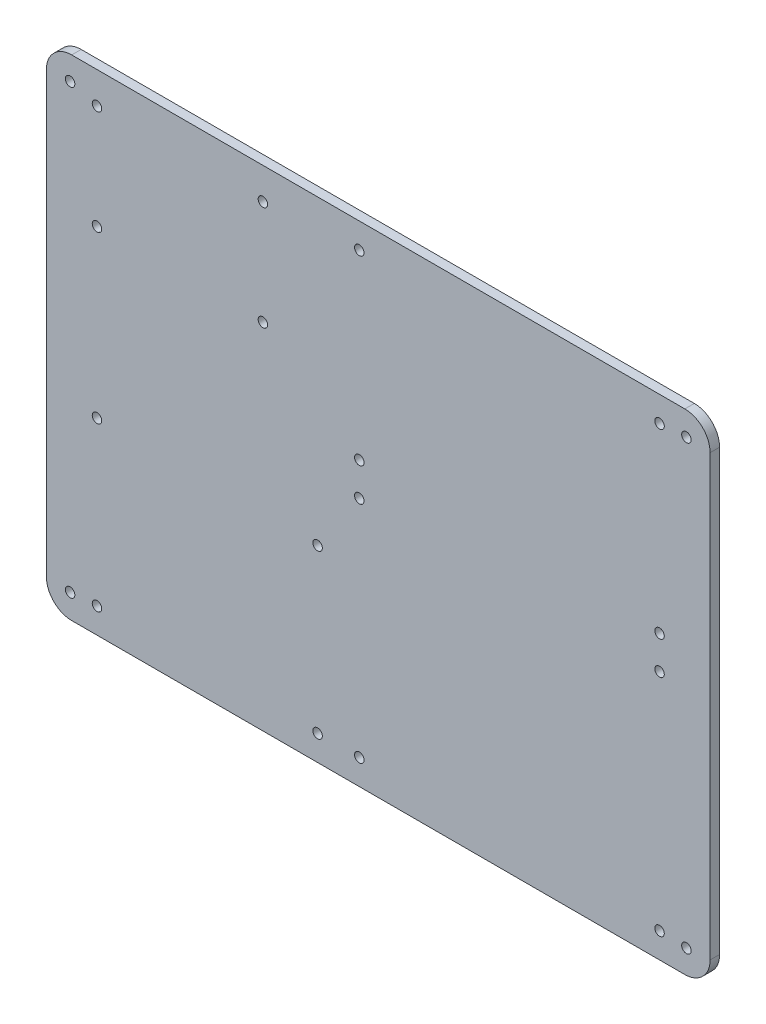
ISO-10303-21;
HEADER;
FILE_DESCRIPTION(('STEP AP214'),'2;1');
FILE_NAME('part.step','',(''),(''),'','','');
FILE_SCHEMA(('AUTOMOTIVE_DESIGN { 1 0 10303 214 1 1 1 1 }'));
ENDSEC;
DATA;
#1=APPLICATION_CONTEXT('core data for automotive mechanical design processes');
#2=APPLICATION_PROTOCOL_DEFINITION('international standard','automotive_design',2000,#1);
#3=PRODUCT_CONTEXT('',#1,'mechanical');
#4=PRODUCT('Part','Part','',(#3));
#5=PRODUCT_RELATED_PRODUCT_CATEGORY('part','',(#4));
#6=PRODUCT_DEFINITION_FORMATION('','',#4);
#7=PRODUCT_DEFINITION_CONTEXT('part definition',#1,'design');
#8=PRODUCT_DEFINITION('design','',#6,#7);
#9=PRODUCT_DEFINITION_SHAPE('','',#8);
#10=(LENGTH_UNIT() NAMED_UNIT(*) SI_UNIT(.MILLI.,.METRE.));
#11=(NAMED_UNIT(*) PLANE_ANGLE_UNIT() SI_UNIT($,.RADIAN.));
#12=(NAMED_UNIT(*) SI_UNIT($,.STERADIAN.) SOLID_ANGLE_UNIT());
#13=UNCERTAINTY_MEASURE_WITH_UNIT(LENGTH_MEASURE(1.E-05),#10,'distance_accuracy_value','');
#14=(GEOMETRIC_REPRESENTATION_CONTEXT(3) GLOBAL_UNCERTAINTY_ASSIGNED_CONTEXT((#13)) GLOBAL_UNIT_ASSIGNED_CONTEXT((#10,
#11,#12)) REPRESENTATION_CONTEXT('',''));
#15=CARTESIAN_POINT('',(0.,0.,0.));
#16=DIRECTION('',(0.,0.,1.));
#17=DIRECTION('',(1.,0.,0.));
#18=AXIS2_PLACEMENT_3D('',#15,#16,#17);
#19=CARTESIAN_POINT('',(0.,77.5,3.));
#20=DIRECTION('',(0.,1.,0.));
#21=DIRECTION('',(0.,0.,1.));
#22=AXIS2_PLACEMENT_3D('',#19,#20,#21);
#23=PLANE('',#22);
#24=DIRECTION('',(1.,0.,0.));
#25=VECTOR('',#24,1.);
#26=CARTESIAN_POINT('',(0.,77.5,0.));
#27=LINE('',#26,#25);
#28=CARTESIAN_POINT('',(-97.,77.5,0.));
#29=VERTEX_POINT('',#28);
#30=CARTESIAN_POINT('',(97.,77.5,0.));
#31=VERTEX_POINT('',#30);
#32=EDGE_CURVE('E154',#29,#31,#27,.T.);
#33=ORIENTED_EDGE('',*,*,#32,.F.);
#34=DIRECTION('',(0.,0.,-1.));
#35=VECTOR('',#34,1.);
#36=CARTESIAN_POINT('',(-97.,77.5,3.));
#37=LINE('',#36,#35);
#38=CARTESIAN_POINT('',(-97.,77.5,3.));
#39=VERTEX_POINT('',#38);
#40=EDGE_CURVE('E12',#39,#29,#37,.T.);
#41=ORIENTED_EDGE('',*,*,#40,.F.);
#42=DIRECTION('',(1.,0.,0.));
#43=VECTOR('',#42,1.);
#44=CARTESIAN_POINT('',(0.,77.5,3.));
#45=LINE('',#44,#43);
#46=CARTESIAN_POINT('',(97.,77.5,3.));
#47=VERTEX_POINT('',#46);
#48=EDGE_CURVE('E350',#39,#47,#45,.T.);
#49=ORIENTED_EDGE('',*,*,#48,.T.);
#50=DIRECTION('',(0.,0.,-1.));
#51=VECTOR('',#50,1.);
#52=CARTESIAN_POINT('',(97.,77.5,3.));
#53=LINE('',#52,#51);
#54=EDGE_CURVE('E60',#47,#31,#53,.T.);
#55=ORIENTED_EDGE('',*,*,#54,.T.);
#56=EDGE_LOOP('',(#33,#41,#49,#55));
#57=FACE_BOUND('',#56,.T.);
#58=ADVANCED_FACE('F41',(#57),#23,.T.);
#59=CARTESIAN_POINT('',(-97.,69.5,3.));
#60=DIRECTION('',(0.,0.,-1.));
#61=DIRECTION('',(-1.,0.,0.));
#62=AXIS2_PLACEMENT_3D('',#59,#60,#61);
#63=CYLINDRICAL_SURFACE('',#62,8.);
#64=CARTESIAN_POINT('',(-97.,69.5,0.));
#65=DIRECTION('',(0.,0.,1.));
#66=DIRECTION('',(1.,0.,0.));
#67=AXIS2_PLACEMENT_3D('',#64,#65,#66);
#68=CIRCLE('',#67,8.);
#69=CARTESIAN_POINT('',(-105.,69.5,0.));
#70=VERTEX_POINT('',#69);
#71=EDGE_CURVE('E156',#29,#70,#68,.T.);
#72=ORIENTED_EDGE('',*,*,#71,.T.);
#73=DIRECTION('',(0.,0.,-1.));
#74=VECTOR('',#73,1.);
#75=CARTESIAN_POINT('',(-105.,69.5,3.));
#76=LINE('',#75,#74);
#77=CARTESIAN_POINT('',(-105.,69.5,3.));
#78=VERTEX_POINT('',#77);
#79=EDGE_CURVE('E51',#78,#70,#76,.T.);
#80=ORIENTED_EDGE('',*,*,#79,.F.);
#81=CARTESIAN_POINT('',(-97.,69.5,3.));
#82=DIRECTION('',(0.,0.,1.));
#83=DIRECTION('',(1.,0.,0.));
#84=AXIS2_PLACEMENT_3D('',#81,#82,#83);
#85=CIRCLE('',#84,8.);
#86=EDGE_CURVE('E354',#39,#78,#85,.T.);
#87=ORIENTED_EDGE('',*,*,#86,.F.);
#88=ORIENTED_EDGE('',*,*,#40,.T.);
#89=EDGE_LOOP('',(#72,#80,#87,#88));
#90=FACE_BOUND('',#89,.T.);
#91=ADVANCED_FACE('F402',(#90),#63,.T.);
#92=CARTESIAN_POINT('',(-105.,0.,3.));
#93=DIRECTION('',(1.,0.,0.));
#94=DIRECTION('',(0.,1.,0.));
#95=AXIS2_PLACEMENT_3D('',#92,#93,#94);
#96=PLANE('',#95);
#97=DIRECTION('',(0.,-1.,0.));
#98=VECTOR('',#97,1.);
#99=CARTESIAN_POINT('',(-105.,0.,0.));
#100=LINE('',#99,#98);
#101=CARTESIAN_POINT('',(-105.,-69.5,0.));
#102=VERTEX_POINT('',#101);
#103=EDGE_CURVE('E159',#70,#102,#100,.T.);
#104=ORIENTED_EDGE('',*,*,#103,.T.);
#105=DIRECTION('',(0.,0.,-1.));
#106=VECTOR('',#105,1.);
#107=CARTESIAN_POINT('',(-105.,-69.5,3.));
#108=LINE('',#107,#106);
#109=CARTESIAN_POINT('',(-105.,-69.5,3.));
#110=VERTEX_POINT('',#109);
#111=EDGE_CURVE('E181',#110,#102,#108,.T.);
#112=ORIENTED_EDGE('',*,*,#111,.F.);
#113=DIRECTION('',(0.,-1.,0.));
#114=VECTOR('',#113,1.);
#115=CARTESIAN_POINT('',(-105.,0.,3.));
#116=LINE('',#115,#114);
#117=EDGE_CURVE('E373',#78,#110,#116,.T.);
#118=ORIENTED_EDGE('',*,*,#117,.F.);
#119=ORIENTED_EDGE('',*,*,#79,.T.);
#120=EDGE_LOOP('',(#104,#112,#118,#119));
#121=FACE_BOUND('',#120,.T.);
#122=ADVANCED_FACE('F407',(#121),#96,.F.);
#123=CARTESIAN_POINT('',(-97.,-69.5,3.));
#124=DIRECTION('',(0.,0.,-1.));
#125=DIRECTION('',(-1.,0.,0.));
#126=AXIS2_PLACEMENT_3D('',#123,#124,#125);
#127=CYLINDRICAL_SURFACE('',#126,7.99999999999999);
#128=CARTESIAN_POINT('',(-97.,-69.5,0.));
#129=DIRECTION('',(0.,0.,1.));
#130=DIRECTION('',(1.,0.,0.));
#131=AXIS2_PLACEMENT_3D('',#128,#129,#130);
#132=CIRCLE('',#131,7.99999999999999);
#133=CARTESIAN_POINT('',(-97.,-77.5,0.));
#134=VERTEX_POINT('',#133);
#135=EDGE_CURVE('E162',#102,#134,#132,.T.);
#136=ORIENTED_EDGE('',*,*,#135,.T.);
#137=DIRECTION('',(0.,0.,-1.));
#138=VECTOR('',#137,1.);
#139=CARTESIAN_POINT('',(-97.,-77.5,3.));
#140=LINE('',#139,#138);
#141=CARTESIAN_POINT('',(-97.,-77.5,3.));
#142=VERTEX_POINT('',#141);
#143=EDGE_CURVE('E178',#142,#134,#140,.T.);
#144=ORIENTED_EDGE('',*,*,#143,.F.);
#145=CARTESIAN_POINT('',(-97.,-69.5,3.));
#146=DIRECTION('',(0.,0.,1.));
#147=DIRECTION('',(1.,0.,0.));
#148=AXIS2_PLACEMENT_3D('',#145,#146,#147);
#149=CIRCLE('',#148,7.99999999999999);
#150=EDGE_CURVE('E378',#110,#142,#149,.T.);
#151=ORIENTED_EDGE('',*,*,#150,.F.);
#152=ORIENTED_EDGE('',*,*,#111,.T.);
#153=EDGE_LOOP('',(#136,#144,#151,#152));
#154=FACE_BOUND('',#153,.T.);
#155=ADVANCED_FACE('F387',(#154),#127,.T.);
#156=CARTESIAN_POINT('',(0.,-77.5,3.));
#157=DIRECTION('',(0.,1.,0.));
#158=DIRECTION('',(0.,0.,1.));
#159=AXIS2_PLACEMENT_3D('',#156,#157,#158);
#160=PLANE('',#159);
#161=DIRECTION('',(1.,0.,0.));
#162=VECTOR('',#161,1.);
#163=CARTESIAN_POINT('',(0.,-77.5,0.));
#164=LINE('',#163,#162);
#165=CARTESIAN_POINT('',(97.,-77.5,0.));
#166=VERTEX_POINT('',#165);
#167=EDGE_CURVE('E165',#134,#166,#164,.T.);
#168=ORIENTED_EDGE('',*,*,#167,.T.);
#169=DIRECTION('',(0.,0.,-1.));
#170=VECTOR('',#169,1.);
#171=CARTESIAN_POINT('',(97.,-77.5,3.));
#172=LINE('',#171,#170);
#173=CARTESIAN_POINT('',(97.,-77.5,3.));
#174=VERTEX_POINT('',#173);
#175=EDGE_CURVE('E130',#174,#166,#172,.T.);
#176=ORIENTED_EDGE('',*,*,#175,.F.);
#177=DIRECTION('',(1.,0.,0.));
#178=VECTOR('',#177,1.);
#179=CARTESIAN_POINT('',(0.,-77.5,3.));
#180=LINE('',#179,#178);
#181=EDGE_CURVE('E118',#142,#174,#180,.T.);
#182=ORIENTED_EDGE('',*,*,#181,.F.);
#183=ORIENTED_EDGE('',*,*,#143,.T.);
#184=EDGE_LOOP('',(#168,#176,#182,#183));
#185=FACE_BOUND('',#184,.T.);
#186=ADVANCED_FACE('F389',(#185),#160,.F.);
#187=CARTESIAN_POINT('',(97.,-69.5,3.));
#188=DIRECTION('',(0.,0.,-1.));
#189=DIRECTION('',(-1.,0.,0.));
#190=AXIS2_PLACEMENT_3D('',#187,#188,#189);
#191=CYLINDRICAL_SURFACE('',#190,7.99999999999998);
#192=CARTESIAN_POINT('',(97.,-69.5,0.));
#193=DIRECTION('',(0.,0.,1.));
#194=DIRECTION('',(1.,0.,0.));
#195=AXIS2_PLACEMENT_3D('',#192,#193,#194);
#196=CIRCLE('',#195,7.99999999999998);
#197=CARTESIAN_POINT('',(105.,-69.5,0.));
#198=VERTEX_POINT('',#197);
#199=EDGE_CURVE('E127',#166,#198,#196,.T.);
#200=ORIENTED_EDGE('',*,*,#199,.T.);
#201=DIRECTION('',(0.,0.,-1.));
#202=VECTOR('',#201,1.);
#203=CARTESIAN_POINT('',(105.,-69.5,3.));
#204=LINE('',#203,#202);
#205=CARTESIAN_POINT('',(105.,-69.5,3.));
#206=VERTEX_POINT('',#205);
#207=EDGE_CURVE('E125',#206,#198,#204,.T.);
#208=ORIENTED_EDGE('',*,*,#207,.F.);
#209=CARTESIAN_POINT('',(97.,-69.5,3.));
#210=DIRECTION('',(0.,0.,1.));
#211=DIRECTION('',(1.,0.,0.));
#212=AXIS2_PLACEMENT_3D('',#209,#210,#211);
#213=CIRCLE('',#212,7.99999999999998);
#214=EDGE_CURVE('E110',#174,#206,#213,.T.);
#215=ORIENTED_EDGE('',*,*,#214,.F.);
#216=ORIENTED_EDGE('',*,*,#175,.T.);
#217=EDGE_LOOP('',(#200,#208,#215,#216));
#218=FACE_BOUND('',#217,.T.);
#219=ADVANCED_FACE('F126',(#218),#191,.T.);
#220=CARTESIAN_POINT('',(105.,0.,3.));
#221=DIRECTION('',(1.,0.,0.));
#222=DIRECTION('',(0.,1.,0.));
#223=AXIS2_PLACEMENT_3D('',#220,#221,#222);
#224=PLANE('',#223);
#225=DIRECTION('',(0.,-1.,0.));
#226=VECTOR('',#225,1.);
#227=CARTESIAN_POINT('',(105.,0.,0.));
#228=LINE('',#227,#226);
#229=CARTESIAN_POINT('',(105.,69.5,0.));
#230=VERTEX_POINT('',#229);
#231=EDGE_CURVE('E169',#230,#198,#228,.T.);
#232=ORIENTED_EDGE('',*,*,#231,.F.);
#233=DIRECTION('',(0.,0.,-1.));
#234=VECTOR('',#233,1.);
#235=CARTESIAN_POINT('',(105.,69.5,3.));
#236=LINE('',#235,#234);
#237=CARTESIAN_POINT('',(105.,69.5,3.));
#238=VERTEX_POINT('',#237);
#239=EDGE_CURVE('E85',#238,#230,#236,.T.);
#240=ORIENTED_EDGE('',*,*,#239,.F.);
#241=DIRECTION('',(0.,-1.,0.));
#242=VECTOR('',#241,1.);
#243=CARTESIAN_POINT('',(105.,0.,3.));
#244=LINE('',#243,#242);
#245=EDGE_CURVE('E116',#238,#206,#244,.T.);
#246=ORIENTED_EDGE('',*,*,#245,.T.);
#247=ORIENTED_EDGE('',*,*,#207,.T.);
#248=EDGE_LOOP('',(#232,#240,#246,#247));
#249=FACE_BOUND('',#248,.T.);
#250=ADVANCED_FACE('F132',(#249),#224,.T.);
#251=CARTESIAN_POINT('',(97.5,-70.,3.));
#252=DIRECTION('',(0.,0.,-1.));
#253=DIRECTION('',(-1.,0.,0.));
#254=AXIS2_PLACEMENT_3D('',#251,#252,#253);
#255=CYLINDRICAL_SURFACE('',#254,1.5);
#256=CARTESIAN_POINT('',(97.5,-70.,3.));
#257=DIRECTION('',(0.,0.,1.));
#258=DIRECTION('',(1.,0.,0.));
#259=AXIS2_PLACEMENT_3D('',#256,#257,#258);
#260=CIRCLE('',#259,1.5);
#261=CARTESIAN_POINT('',(99.,-70.,3.));
#262=VERTEX_POINT('',#261);
#263=EDGE_CURVE('E347',#262,#262,#260,.T.);
#264=ORIENTED_EDGE('',*,*,#263,.T.);
#265=EDGE_LOOP('',(#264));
#266=FACE_BOUND('',#265,.T.);
#267=CARTESIAN_POINT('',(97.5,-70.,0.));
#268=DIRECTION('',(0.,0.,1.));
#269=DIRECTION('',(1.,0.,0.));
#270=AXIS2_PLACEMENT_3D('',#267,#268,#269);
#271=CIRCLE('',#270,1.5);
#272=CARTESIAN_POINT('',(99.,-70.,0.));
#273=VERTEX_POINT('',#272);
#274=EDGE_CURVE('E151',#273,#273,#271,.T.);
#275=ORIENTED_EDGE('',*,*,#274,.F.);
#276=EDGE_LOOP('',(#275));
#277=FACE_BOUND('',#276,.T.);
#278=ADVANCED_FACE('F412',(#266,#277),#255,.F.);
#279=CARTESIAN_POINT('',(-97.5,-70.,3.));
#280=DIRECTION('',(0.,0.,-1.));
#281=DIRECTION('',(-1.,0.,0.));
#282=AXIS2_PLACEMENT_3D('',#279,#280,#281);
#283=CYLINDRICAL_SURFACE('',#282,1.5);
#284=CARTESIAN_POINT('',(-97.5,-70.,3.));
#285=DIRECTION('',(0.,0.,1.));
#286=DIRECTION('',(1.,0.,0.));
#287=AXIS2_PLACEMENT_3D('',#284,#285,#286);
#288=CIRCLE('',#287,1.5);
#289=CARTESIAN_POINT('',(-96.,-70.,3.));
#290=VERTEX_POINT('',#289);
#291=EDGE_CURVE('E344',#290,#290,#288,.T.);
#292=ORIENTED_EDGE('',*,*,#291,.T.);
#293=EDGE_LOOP('',(#292));
#294=FACE_BOUND('',#293,.T.);
#295=CARTESIAN_POINT('',(-97.5,-70.,0.));
#296=DIRECTION('',(0.,0.,1.));
#297=DIRECTION('',(1.,0.,0.));
#298=AXIS2_PLACEMENT_3D('',#295,#296,#297);
#299=CIRCLE('',#298,1.5);
#300=CARTESIAN_POINT('',(-96.,-70.,0.));
#301=VERTEX_POINT('',#300);
#302=EDGE_CURVE('E148',#301,#301,#299,.T.);
#303=ORIENTED_EDGE('',*,*,#302,.F.);
#304=EDGE_LOOP('',(#303));
#305=FACE_BOUND('',#304,.T.);
#306=ADVANCED_FACE('F415',(#294,#305),#283,.F.);
#307=CARTESIAN_POINT('',(97.5,70.,3.));
#308=DIRECTION('',(0.,0.,-1.));
#309=DIRECTION('',(-1.,0.,0.));
#310=AXIS2_PLACEMENT_3D('',#307,#308,#309);
#311=CYLINDRICAL_SURFACE('',#310,1.5);
#312=CARTESIAN_POINT('',(97.5,70.,3.));
#313=DIRECTION('',(0.,0.,1.));
#314=DIRECTION('',(1.,0.,0.));
#315=AXIS2_PLACEMENT_3D('',#312,#313,#314);
#316=CIRCLE('',#315,1.5);
#317=CARTESIAN_POINT('',(99.,70.,3.));
#318=VERTEX_POINT('',#317);
#319=EDGE_CURVE('E340',#318,#318,#316,.T.);
#320=ORIENTED_EDGE('',*,*,#319,.T.);
#321=EDGE_LOOP('',(#320));
#322=FACE_BOUND('',#321,.T.);
#323=CARTESIAN_POINT('',(97.5,70.,0.));
#324=DIRECTION('',(0.,0.,1.));
#325=DIRECTION('',(1.,0.,0.));
#326=AXIS2_PLACEMENT_3D('',#323,#324,#325);
#327=CIRCLE('',#326,1.5);
#328=CARTESIAN_POINT('',(99.,70.,0.));
#329=VERTEX_POINT('',#328);
#330=EDGE_CURVE('E144',#329,#329,#327,.T.);
#331=ORIENTED_EDGE('',*,*,#330,.F.);
#332=EDGE_LOOP('',(#331));
#333=FACE_BOUND('',#332,.T.);
#334=ADVANCED_FACE('F397',(#322,#333),#311,.F.);
#335=CARTESIAN_POINT('',(-97.5,70.,3.));
#336=DIRECTION('',(0.,0.,-1.));
#337=DIRECTION('',(-1.,0.,0.));
#338=AXIS2_PLACEMENT_3D('',#335,#336,#337);
#339=CYLINDRICAL_SURFACE('',#338,1.5);
#340=CARTESIAN_POINT('',(-97.5,70.,3.));
#341=DIRECTION('',(0.,0.,1.));
#342=DIRECTION('',(1.,0.,0.));
#343=AXIS2_PLACEMENT_3D('',#340,#341,#342);
#344=CIRCLE('',#343,1.5);
#345=CARTESIAN_POINT('',(-96.,70.,3.));
#346=VERTEX_POINT('',#345);
#347=EDGE_CURVE('E174',#346,#346,#344,.T.);
#348=ORIENTED_EDGE('',*,*,#347,.T.);
#349=EDGE_LOOP('',(#348));
#350=FACE_BOUND('',#349,.T.);
#351=CARTESIAN_POINT('',(-97.5,70.,0.));
#352=DIRECTION('',(0.,0.,1.));
#353=DIRECTION('',(1.,0.,0.));
#354=AXIS2_PLACEMENT_3D('',#351,#352,#353);
#355=CIRCLE('',#354,1.5);
#356=CARTESIAN_POINT('',(-96.,70.,0.));
#357=VERTEX_POINT('',#356);
#358=EDGE_CURVE('E141',#357,#357,#355,.T.);
#359=ORIENTED_EDGE('',*,*,#358,.F.);
#360=EDGE_LOOP('',(#359));
#361=FACE_BOUND('',#360,.T.);
#362=ADVANCED_FACE('F43',(#350,#361),#339,.F.);
#363=CARTESIAN_POINT('',(97.,69.5,3.));
#364=DIRECTION('',(0.,0.,-1.));
#365=DIRECTION('',(-1.,0.,0.));
#366=AXIS2_PLACEMENT_3D('',#363,#364,#365);
#367=CYLINDRICAL_SURFACE('',#366,8.00000000000001);
#368=CARTESIAN_POINT('',(97.,69.5,0.));
#369=DIRECTION('',(0.,0.,1.));
#370=DIRECTION('',(1.,0.,0.));
#371=AXIS2_PLACEMENT_3D('',#368,#369,#370);
#372=CIRCLE('',#371,8.00000000000001);
#373=EDGE_CURVE('E171',#31,#230,#372,.F.);
#374=ORIENTED_EDGE('',*,*,#373,.F.);
#375=ORIENTED_EDGE('',*,*,#54,.F.);
#376=CARTESIAN_POINT('',(97.,69.5,3.));
#377=DIRECTION('',(0.,0.,1.));
#378=DIRECTION('',(1.,0.,0.));
#379=AXIS2_PLACEMENT_3D('',#376,#377,#378);
#380=CIRCLE('',#379,8.00000000000001);
#381=EDGE_CURVE('E134',#47,#238,#380,.F.);
#382=ORIENTED_EDGE('',*,*,#381,.T.);
#383=ORIENTED_EDGE('',*,*,#239,.T.);
#384=EDGE_LOOP('',(#374,#375,#382,#383));
#385=FACE_BOUND('',#384,.T.);
#386=ADVANCED_FACE('F293',(#385),#367,.T.);
#387=CARTESIAN_POINT('',(0.,0.,3.));
#388=DIRECTION('',(0.,0.,1.));
#389=DIRECTION('',(1.,0.,0.));
#390=AXIS2_PLACEMENT_3D('',#387,#388,#389);
#391=PLANE('',#390);
#392=CARTESIAN_POINT('',(-36.5,67.5,3.));
#393=DIRECTION('',(0.,0.,1.));
#394=DIRECTION('',(1.,0.,0.));
#395=AXIS2_PLACEMENT_3D('',#392,#393,#394);
#396=CIRCLE('',#395,1.5);
#397=CARTESIAN_POINT('',(-35.,67.5,3.));
#398=VERTEX_POINT('',#397);
#399=EDGE_CURVE('E271',#398,#398,#396,.T.);
#400=ORIENTED_EDGE('',*,*,#399,.F.);
#401=EDGE_LOOP('',(#400));
#402=FACE_BOUND('',#401,.T.);
#403=CARTESIAN_POINT('',(-89.,34.5,3.));
#404=DIRECTION('',(0.,0.,1.));
#405=DIRECTION('',(1.,0.,0.));
#406=AXIS2_PLACEMENT_3D('',#403,#404,#405);
#407=CIRCLE('',#406,1.5);
#408=CARTESIAN_POINT('',(-87.5,34.5,3.));
#409=VERTEX_POINT('',#408);
#410=EDGE_CURVE('E272',#409,#409,#407,.T.);
#411=ORIENTED_EDGE('',*,*,#410,.F.);
#412=EDGE_LOOP('',(#411));
#413=FACE_BOUND('',#412,.T.);
#414=CARTESIAN_POINT('',(-36.5,34.5,3.));
#415=DIRECTION('',(0.,0.,1.));
#416=DIRECTION('',(1.,0.,0.));
#417=AXIS2_PLACEMENT_3D('',#414,#415,#416);
#418=CIRCLE('',#417,1.5);
#419=CARTESIAN_POINT('',(-35.,34.5,3.));
#420=VERTEX_POINT('',#419);
#421=EDGE_CURVE('E277',#420,#420,#418,.T.);
#422=ORIENTED_EDGE('',*,*,#421,.F.);
#423=EDGE_LOOP('',(#422));
#424=FACE_BOUND('',#423,.T.);
#425=CARTESIAN_POINT('',(-89.,67.5,3.));
#426=DIRECTION('',(0.,0.,1.));
#427=DIRECTION('',(1.,0.,0.));
#428=AXIS2_PLACEMENT_3D('',#425,#426,#427);
#429=CIRCLE('',#428,1.5);
#430=CARTESIAN_POINT('',(-87.5,67.5,3.));
#431=VERTEX_POINT('',#430);
#432=EDGE_CURVE('E230',#431,#431,#429,.T.);
#433=ORIENTED_EDGE('',*,*,#432,.F.);
#434=EDGE_LOOP('',(#433));
#435=FACE_BOUND('',#434,.T.);
#436=CARTESIAN_POINT('',(-89.,-69.5,3.));
#437=DIRECTION('',(0.,0.,1.));
#438=DIRECTION('',(1.,0.,0.));
#439=AXIS2_PLACEMENT_3D('',#436,#437,#438);
#440=CIRCLE('',#439,1.50000000000001);
#441=CARTESIAN_POINT('',(-87.5,-69.5,3.));
#442=VERTEX_POINT('',#441);
#443=EDGE_CURVE('E237',#442,#442,#440,.T.);
#444=ORIENTED_EDGE('',*,*,#443,.F.);
#445=EDGE_LOOP('',(#444));
#446=FACE_BOUND('',#445,.T.);
#447=CARTESIAN_POINT('',(-19.2,-69.5,3.));
#448=DIRECTION('',(0.,0.,1.));
#449=DIRECTION('',(1.,0.,0.));
#450=AXIS2_PLACEMENT_3D('',#447,#448,#449);
#451=CIRCLE('',#450,1.5);
#452=CARTESIAN_POINT('',(-17.7,-69.5,3.));
#453=VERTEX_POINT('',#452);
#454=EDGE_CURVE('E242',#453,#453,#451,.T.);
#455=ORIENTED_EDGE('',*,*,#454,.F.);
#456=EDGE_LOOP('',(#455));
#457=FACE_BOUND('',#456,.T.);
#458=CARTESIAN_POINT('',(-19.2,-18.,3.));
#459=DIRECTION('',(0.,0.,1.));
#460=DIRECTION('',(1.,0.,0.));
#461=AXIS2_PLACEMENT_3D('',#458,#459,#460);
#462=CIRCLE('',#461,1.50000000000001);
#463=CARTESIAN_POINT('',(-17.7,-18.,3.));
#464=VERTEX_POINT('',#463);
#465=EDGE_CURVE('E249',#464,#464,#462,.T.);
#466=ORIENTED_EDGE('',*,*,#465,.F.);
#467=EDGE_LOOP('',(#466));
#468=FACE_BOUND('',#467,.T.);
#469=CARTESIAN_POINT('',(-89.,-18.,3.));
#470=DIRECTION('',(0.,0.,1.));
#471=DIRECTION('',(1.,0.,0.));
#472=AXIS2_PLACEMENT_3D('',#469,#470,#471);
#473=CIRCLE('',#472,1.5);
#474=CARTESIAN_POINT('',(-87.5,-18.,3.));
#475=VERTEX_POINT('',#474);
#476=EDGE_CURVE('E216',#475,#475,#473,.T.);
#477=ORIENTED_EDGE('',*,*,#476,.F.);
#478=EDGE_LOOP('',(#477));
#479=FACE_BOUND('',#478,.T.);
#480=CARTESIAN_POINT('',(89.,1.49999999999999,3.));
#481=DIRECTION('',(0.,0.,1.));
#482=DIRECTION('',(1.,0.,0.));
#483=AXIS2_PLACEMENT_3D('',#480,#481,#482);
#484=CIRCLE('',#483,1.5);
#485=CARTESIAN_POINT('',(90.5,1.49999999999999,3.));
#486=VERTEX_POINT('',#485);
#487=EDGE_CURVE('E309',#486,#486,#484,.T.);
#488=ORIENTED_EDGE('',*,*,#487,.F.);
#489=EDGE_LOOP('',(#488));
#490=FACE_BOUND('',#489,.T.);
#491=CARTESIAN_POINT('',(-6.00000000000001,-69.5,3.));
#492=DIRECTION('',(0.,0.,1.));
#493=DIRECTION('',(1.,0.,0.));
#494=AXIS2_PLACEMENT_3D('',#491,#492,#493);
#495=CIRCLE('',#494,1.5);
#496=CARTESIAN_POINT('',(-4.5,-69.5,3.));
#497=VERTEX_POINT('',#496);
#498=EDGE_CURVE('E313',#497,#497,#495,.T.);
#499=ORIENTED_EDGE('',*,*,#498,.F.);
#500=EDGE_LOOP('',(#499));
#501=FACE_BOUND('',#500,.T.);
#502=CARTESIAN_POINT('',(89.,-69.5,3.));
#503=DIRECTION('',(0.,0.,1.));
#504=DIRECTION('',(1.,0.,0.));
#505=AXIS2_PLACEMENT_3D('',#502,#503,#504);
#506=CIRCLE('',#505,1.5);
#507=CARTESIAN_POINT('',(90.5,-69.5,3.));
#508=VERTEX_POINT('',#507);
#509=EDGE_CURVE('E225',#508,#508,#506,.T.);
#510=ORIENTED_EDGE('',*,*,#509,.F.);
#511=EDGE_LOOP('',(#510));
#512=FACE_BOUND('',#511,.T.);
#513=CARTESIAN_POINT('',(-6.00000000000001,1.49999999999999,3.));
#514=DIRECTION('',(0.,0.,1.));
#515=DIRECTION('',(1.,0.,0.));
#516=AXIS2_PLACEMENT_3D('',#513,#514,#515);
#517=CIRCLE('',#516,1.5);
#518=CARTESIAN_POINT('',(-4.5,1.49999999999999,3.));
#519=VERTEX_POINT('',#518);
#520=EDGE_CURVE('E202',#519,#519,#517,.T.);
#521=ORIENTED_EDGE('',*,*,#520,.F.);
#522=EDGE_LOOP('',(#521));
#523=FACE_BOUND('',#522,.T.);
#524=CARTESIAN_POINT('',(89.,69.5,3.));
#525=DIRECTION('',(0.,0.,1.));
#526=DIRECTION('',(1.,0.,0.));
#527=AXIS2_PLACEMENT_3D('',#524,#525,#526);
#528=CIRCLE('',#527,1.5);
#529=CARTESIAN_POINT('',(90.5,69.5,3.));
#530=VERTEX_POINT('',#529);
#531=EDGE_CURVE('E323',#530,#530,#528,.T.);
#532=ORIENTED_EDGE('',*,*,#531,.F.);
#533=EDGE_LOOP('',(#532));
#534=FACE_BOUND('',#533,.T.);
#535=CARTESIAN_POINT('',(-6.00000000000001,12.,3.));
#536=DIRECTION('',(0.,0.,1.));
#537=DIRECTION('',(1.,0.,0.));
#538=AXIS2_PLACEMENT_3D('',#535,#536,#537);
#539=CIRCLE('',#538,1.5);
#540=CARTESIAN_POINT('',(-4.50000000000001,12.,3.));
#541=VERTEX_POINT('',#540);
#542=EDGE_CURVE('E327',#541,#541,#539,.T.);
#543=ORIENTED_EDGE('',*,*,#542,.F.);
#544=EDGE_LOOP('',(#543));
#545=FACE_BOUND('',#544,.T.);
#546=CARTESIAN_POINT('',(89.,12.,3.));
#547=DIRECTION('',(0.,0.,1.));
#548=DIRECTION('',(1.,0.,0.));
#549=AXIS2_PLACEMENT_3D('',#546,#547,#548);
#550=CIRCLE('',#549,1.5);
#551=CARTESIAN_POINT('',(90.5,12.,3.));
#552=VERTEX_POINT('',#551);
#553=EDGE_CURVE('E211',#552,#552,#550,.T.);
#554=ORIENTED_EDGE('',*,*,#553,.F.);
#555=EDGE_LOOP('',(#554));
#556=FACE_BOUND('',#555,.T.);
#557=CARTESIAN_POINT('',(-6.00000000000001,69.5,3.));
#558=DIRECTION('',(0.,0.,1.));
#559=DIRECTION('',(1.,0.,0.));
#560=AXIS2_PLACEMENT_3D('',#557,#558,#559);
#561=CIRCLE('',#560,1.5);
#562=CARTESIAN_POINT('',(-4.50000000000001,69.5,3.));
#563=VERTEX_POINT('',#562);
#564=EDGE_CURVE('E190',#563,#563,#561,.T.);
#565=ORIENTED_EDGE('',*,*,#564,.F.);
#566=EDGE_LOOP('',(#565));
#567=FACE_BOUND('',#566,.T.);
#568=ORIENTED_EDGE('',*,*,#347,.F.);
#569=EDGE_LOOP('',(#568));
#570=FACE_BOUND('',#569,.T.);
#571=ORIENTED_EDGE('',*,*,#319,.F.);
#572=EDGE_LOOP('',(#571));
#573=FACE_BOUND('',#572,.T.);
#574=ORIENTED_EDGE('',*,*,#291,.F.);
#575=EDGE_LOOP('',(#574));
#576=FACE_BOUND('',#575,.T.);
#577=ORIENTED_EDGE('',*,*,#263,.F.);
#578=EDGE_LOOP('',(#577));
#579=FACE_BOUND('',#578,.T.);
#580=ORIENTED_EDGE('',*,*,#48,.F.);
#581=ORIENTED_EDGE('',*,*,#86,.T.);
#582=ORIENTED_EDGE('',*,*,#117,.T.);
#583=ORIENTED_EDGE('',*,*,#150,.T.);
#584=ORIENTED_EDGE('',*,*,#181,.T.);
#585=ORIENTED_EDGE('',*,*,#214,.T.);
#586=ORIENTED_EDGE('',*,*,#245,.F.);
#587=ORIENTED_EDGE('',*,*,#381,.F.);
#588=EDGE_LOOP('',(#580,#581,#582,#583,#584,#585,#586,#587));
#589=FACE_BOUND('',#588,.T.);
#590=ADVANCED_FACE('F113',(#402,#413,#424,#435,#446,#457,#468,#479,#490,#501,#512,#523,#534,
#545,#556,#567,#570,#573,#576,#579,#589),#391,.T.);
#591=CARTESIAN_POINT('',(0.,0.,0.));
#592=DIRECTION('',(0.,0.,1.));
#593=DIRECTION('',(1.,0.,0.));
#594=AXIS2_PLACEMENT_3D('',#591,#592,#593);
#595=PLANE('',#594);
#596=CARTESIAN_POINT('',(-36.5,67.5,0.));
#597=DIRECTION('',(0.,0.,1.));
#598=DIRECTION('',(1.,0.,0.));
#599=AXIS2_PLACEMENT_3D('',#596,#597,#598);
#600=CIRCLE('',#599,1.5);
#601=CARTESIAN_POINT('',(-35.,67.5,0.));
#602=VERTEX_POINT('',#601);
#603=EDGE_CURVE('E45',#602,#602,#600,.T.);
#604=ORIENTED_EDGE('',*,*,#603,.T.);
#605=EDGE_LOOP('',(#604));
#606=FACE_BOUND('',#605,.T.);
#607=CARTESIAN_POINT('',(-89.,34.5,0.));
#608=DIRECTION('',(0.,0.,1.));
#609=DIRECTION('',(1.,0.,0.));
#610=AXIS2_PLACEMENT_3D('',#607,#608,#609);
#611=CIRCLE('',#610,1.5);
#612=CARTESIAN_POINT('',(-87.5,34.5,0.));
#613=VERTEX_POINT('',#612);
#614=EDGE_CURVE('E232',#613,#613,#611,.T.);
#615=ORIENTED_EDGE('',*,*,#614,.T.);
#616=EDGE_LOOP('',(#615));
#617=FACE_BOUND('',#616,.T.);
#618=CARTESIAN_POINT('',(-36.5,34.5,0.));
#619=DIRECTION('',(0.,0.,1.));
#620=DIRECTION('',(1.,0.,0.));
#621=AXIS2_PLACEMENT_3D('',#618,#619,#620);
#622=CIRCLE('',#621,1.5);
#623=CARTESIAN_POINT('',(-35.,34.5,0.));
#624=VERTEX_POINT('',#623);
#625=EDGE_CURVE('E229',#624,#624,#622,.T.);
#626=ORIENTED_EDGE('',*,*,#625,.T.);
#627=EDGE_LOOP('',(#626));
#628=FACE_BOUND('',#627,.T.);
#629=CARTESIAN_POINT('',(-89.,67.5,0.));
#630=DIRECTION('',(0.,0.,1.));
#631=DIRECTION('',(1.,0.,0.));
#632=AXIS2_PLACEMENT_3D('',#629,#630,#631);
#633=CIRCLE('',#632,1.5);
#634=CARTESIAN_POINT('',(-87.5,67.5,0.));
#635=VERTEX_POINT('',#634);
#636=EDGE_CURVE('E226',#635,#635,#633,.T.);
#637=ORIENTED_EDGE('',*,*,#636,.T.);
#638=EDGE_LOOP('',(#637));
#639=FACE_BOUND('',#638,.T.);
#640=CARTESIAN_POINT('',(-89.,-69.5,0.));
#641=DIRECTION('',(0.,0.,1.));
#642=DIRECTION('',(1.,0.,0.));
#643=AXIS2_PLACEMENT_3D('',#640,#641,#642);
#644=CIRCLE('',#643,1.50000000000001);
#645=CARTESIAN_POINT('',(-87.5,-69.5,0.));
#646=VERTEX_POINT('',#645);
#647=EDGE_CURVE('E222',#646,#646,#644,.T.);
#648=ORIENTED_EDGE('',*,*,#647,.T.);
#649=EDGE_LOOP('',(#648));
#650=FACE_BOUND('',#649,.T.);
#651=CARTESIAN_POINT('',(-19.2,-69.5,0.));
#652=DIRECTION('',(0.,0.,1.));
#653=DIRECTION('',(1.,0.,0.));
#654=AXIS2_PLACEMENT_3D('',#651,#652,#653);
#655=CIRCLE('',#654,1.5);
#656=CARTESIAN_POINT('',(-17.7,-69.5,0.));
#657=VERTEX_POINT('',#656);
#658=EDGE_CURVE('E219',#657,#657,#655,.T.);
#659=ORIENTED_EDGE('',*,*,#658,.T.);
#660=EDGE_LOOP('',(#659));
#661=FACE_BOUND('',#660,.T.);
#662=CARTESIAN_POINT('',(-19.2,-18.,0.));
#663=DIRECTION('',(0.,0.,1.));
#664=DIRECTION('',(1.,0.,0.));
#665=AXIS2_PLACEMENT_3D('',#662,#663,#664);
#666=CIRCLE('',#665,1.50000000000001);
#667=CARTESIAN_POINT('',(-17.7,-18.,0.));
#668=VERTEX_POINT('',#667);
#669=EDGE_CURVE('E215',#668,#668,#666,.T.);
#670=ORIENTED_EDGE('',*,*,#669,.T.);
#671=EDGE_LOOP('',(#670));
#672=FACE_BOUND('',#671,.T.);
#673=CARTESIAN_POINT('',(-89.,-18.,0.));
#674=DIRECTION('',(0.,0.,1.));
#675=DIRECTION('',(1.,0.,0.));
#676=AXIS2_PLACEMENT_3D('',#673,#674,#675);
#677=CIRCLE('',#676,1.5);
#678=CARTESIAN_POINT('',(-87.5,-18.,0.));
#679=VERTEX_POINT('',#678);
#680=EDGE_CURVE('E212',#679,#679,#677,.T.);
#681=ORIENTED_EDGE('',*,*,#680,.T.);
#682=EDGE_LOOP('',(#681));
#683=FACE_BOUND('',#682,.T.);
#684=CARTESIAN_POINT('',(89.,1.49999999999999,0.));
#685=DIRECTION('',(0.,0.,1.));
#686=DIRECTION('',(1.,0.,0.));
#687=AXIS2_PLACEMENT_3D('',#684,#685,#686);
#688=CIRCLE('',#687,1.5);
#689=CARTESIAN_POINT('',(90.5,1.49999999999999,0.));
#690=VERTEX_POINT('',#689);
#691=EDGE_CURVE('E208',#690,#690,#688,.T.);
#692=ORIENTED_EDGE('',*,*,#691,.T.);
#693=EDGE_LOOP('',(#692));
#694=FACE_BOUND('',#693,.T.);
#695=CARTESIAN_POINT('',(-6.00000000000001,-69.5,0.));
#696=DIRECTION('',(0.,0.,1.));
#697=DIRECTION('',(1.,0.,0.));
#698=AXIS2_PLACEMENT_3D('',#695,#696,#697);
#699=CIRCLE('',#698,1.5);
#700=CARTESIAN_POINT('',(-4.5,-69.5,0.));
#701=VERTEX_POINT('',#700);
#702=EDGE_CURVE('E205',#701,#701,#699,.T.);
#703=ORIENTED_EDGE('',*,*,#702,.T.);
#704=EDGE_LOOP('',(#703));
#705=FACE_BOUND('',#704,.T.);
#706=CARTESIAN_POINT('',(89.,-69.5,0.));
#707=DIRECTION('',(0.,0.,1.));
#708=DIRECTION('',(1.,0.,0.));
#709=AXIS2_PLACEMENT_3D('',#706,#707,#708);
#710=CIRCLE('',#709,1.5);
#711=CARTESIAN_POINT('',(90.5,-69.5,0.));
#712=VERTEX_POINT('',#711);
#713=EDGE_CURVE('E201',#712,#712,#710,.T.);
#714=ORIENTED_EDGE('',*,*,#713,.T.);
#715=EDGE_LOOP('',(#714));
#716=FACE_BOUND('',#715,.T.);
#717=CARTESIAN_POINT('',(-6.00000000000001,1.49999999999999,0.));
#718=DIRECTION('',(0.,0.,1.));
#719=DIRECTION('',(1.,0.,0.));
#720=AXIS2_PLACEMENT_3D('',#717,#718,#719);
#721=CIRCLE('',#720,1.5);
#722=CARTESIAN_POINT('',(-4.5,1.49999999999999,0.));
#723=VERTEX_POINT('',#722);
#724=EDGE_CURVE('E198',#723,#723,#721,.T.);
#725=ORIENTED_EDGE('',*,*,#724,.T.);
#726=EDGE_LOOP('',(#725));
#727=FACE_BOUND('',#726,.T.);
#728=CARTESIAN_POINT('',(89.,69.5,0.));
#729=DIRECTION('',(0.,0.,1.));
#730=DIRECTION('',(1.,0.,0.));
#731=AXIS2_PLACEMENT_3D('',#728,#729,#730);
#732=CIRCLE('',#731,1.5);
#733=CARTESIAN_POINT('',(90.5,69.5,0.));
#734=VERTEX_POINT('',#733);
#735=EDGE_CURVE('E145',#734,#734,#732,.T.);
#736=ORIENTED_EDGE('',*,*,#735,.T.);
#737=EDGE_LOOP('',(#736));
#738=FACE_BOUND('',#737,.T.);
#739=CARTESIAN_POINT('',(-6.00000000000001,12.,0.));
#740=DIRECTION('',(0.,0.,1.));
#741=DIRECTION('',(1.,0.,0.));
#742=AXIS2_PLACEMENT_3D('',#739,#740,#741);
#743=CIRCLE('',#742,1.5);
#744=CARTESIAN_POINT('',(-4.50000000000001,12.,0.));
#745=VERTEX_POINT('',#744);
#746=EDGE_CURVE('E193',#745,#745,#743,.T.);
#747=ORIENTED_EDGE('',*,*,#746,.T.);
#748=EDGE_LOOP('',(#747));
#749=FACE_BOUND('',#748,.T.);
#750=CARTESIAN_POINT('',(89.,12.,0.));
#751=DIRECTION('',(0.,0.,1.));
#752=DIRECTION('',(1.,0.,0.));
#753=AXIS2_PLACEMENT_3D('',#750,#751,#752);
#754=CIRCLE('',#753,1.5);
#755=CARTESIAN_POINT('',(90.5,12.,0.));
#756=VERTEX_POINT('',#755);
#757=EDGE_CURVE('E189',#756,#756,#754,.T.);
#758=ORIENTED_EDGE('',*,*,#757,.T.);
#759=EDGE_LOOP('',(#758));
#760=FACE_BOUND('',#759,.T.);
#761=CARTESIAN_POINT('',(-6.00000000000001,69.5,0.));
#762=DIRECTION('',(0.,0.,1.));
#763=DIRECTION('',(1.,0.,0.));
#764=AXIS2_PLACEMENT_3D('',#761,#762,#763);
#765=CIRCLE('',#764,1.5);
#766=CARTESIAN_POINT('',(-4.50000000000001,69.5,0.));
#767=VERTEX_POINT('',#766);
#768=EDGE_CURVE('E186',#767,#767,#765,.T.);
#769=ORIENTED_EDGE('',*,*,#768,.T.);
#770=EDGE_LOOP('',(#769));
#771=FACE_BOUND('',#770,.T.);
#772=ORIENTED_EDGE('',*,*,#358,.T.);
#773=EDGE_LOOP('',(#772));
#774=FACE_BOUND('',#773,.T.);
#775=ORIENTED_EDGE('',*,*,#330,.T.);
#776=EDGE_LOOP('',(#775));
#777=FACE_BOUND('',#776,.T.);
#778=ORIENTED_EDGE('',*,*,#302,.T.);
#779=EDGE_LOOP('',(#778));
#780=FACE_BOUND('',#779,.T.);
#781=ORIENTED_EDGE('',*,*,#274,.T.);
#782=EDGE_LOOP('',(#781));
#783=FACE_BOUND('',#782,.T.);
#784=ORIENTED_EDGE('',*,*,#32,.T.);
#785=ORIENTED_EDGE('',*,*,#373,.T.);
#786=ORIENTED_EDGE('',*,*,#231,.T.);
#787=ORIENTED_EDGE('',*,*,#199,.F.);
#788=ORIENTED_EDGE('',*,*,#167,.F.);
#789=ORIENTED_EDGE('',*,*,#135,.F.);
#790=ORIENTED_EDGE('',*,*,#103,.F.);
#791=ORIENTED_EDGE('',*,*,#71,.F.);
#792=EDGE_LOOP('',(#784,#785,#786,#787,#788,#789,#790,#791));
#793=FACE_BOUND('',#792,.T.);
#794=ADVANCED_FACE('F292',(#606,#617,#628,#639,#650,#661,#672,#683,#694,#705,#716,#727,#738,
#749,#760,#771,#774,#777,#780,#783,#793),#595,.F.);
#795=CARTESIAN_POINT('',(-6.00000000000001,69.5,-17.));
#796=DIRECTION('',(0.,0.,1.));
#797=DIRECTION('',(1.,0.,0.));
#798=AXIS2_PLACEMENT_3D('',#795,#796,#797);
#799=CYLINDRICAL_SURFACE('',#798,1.5);
#800=ORIENTED_EDGE('',*,*,#564,.T.);
#801=EDGE_LOOP('',(#800));
#802=FACE_BOUND('',#801,.T.);
#803=ORIENTED_EDGE('',*,*,#768,.F.);
#804=EDGE_LOOP('',(#803));
#805=FACE_BOUND('',#804,.T.);
#806=ADVANCED_FACE('F427',(#802,#805),#799,.F.);
#807=CARTESIAN_POINT('',(89.,12.,-17.));
#808=DIRECTION('',(0.,0.,1.));
#809=DIRECTION('',(1.,0.,0.));
#810=AXIS2_PLACEMENT_3D('',#807,#808,#809);
#811=CYLINDRICAL_SURFACE('',#810,1.5);
#812=ORIENTED_EDGE('',*,*,#553,.T.);
#813=EDGE_LOOP('',(#812));
#814=FACE_BOUND('',#813,.T.);
#815=ORIENTED_EDGE('',*,*,#757,.F.);
#816=EDGE_LOOP('',(#815));
#817=FACE_BOUND('',#816,.T.);
#818=ADVANCED_FACE('F436',(#814,#817),#811,.F.);
#819=CARTESIAN_POINT('',(-6.00000000000001,12.,-17.));
#820=DIRECTION('',(0.,0.,1.));
#821=DIRECTION('',(1.,0.,0.));
#822=AXIS2_PLACEMENT_3D('',#819,#820,#821);
#823=CYLINDRICAL_SURFACE('',#822,1.5);
#824=ORIENTED_EDGE('',*,*,#542,.T.);
#825=EDGE_LOOP('',(#824));
#826=FACE_BOUND('',#825,.T.);
#827=ORIENTED_EDGE('',*,*,#746,.F.);
#828=EDGE_LOOP('',(#827));
#829=FACE_BOUND('',#828,.T.);
#830=ADVANCED_FACE('F440',(#826,#829),#823,.F.);
#831=CARTESIAN_POINT('',(89.,69.5,-17.));
#832=DIRECTION('',(0.,0.,1.));
#833=DIRECTION('',(1.,0.,0.));
#834=AXIS2_PLACEMENT_3D('',#831,#832,#833);
#835=CYLINDRICAL_SURFACE('',#834,1.5);
#836=ORIENTED_EDGE('',*,*,#531,.T.);
#837=EDGE_LOOP('',(#836));
#838=FACE_BOUND('',#837,.T.);
#839=ORIENTED_EDGE('',*,*,#735,.F.);
#840=EDGE_LOOP('',(#839));
#841=FACE_BOUND('',#840,.T.);
#842=ADVANCED_FACE('F443',(#838,#841),#835,.F.);
#843=CARTESIAN_POINT('',(-6.00000000000001,1.49999999999999,-7.));
#844=DIRECTION('',(0.,0.,1.));
#845=DIRECTION('',(1.,0.,0.));
#846=AXIS2_PLACEMENT_3D('',#843,#844,#845);
#847=CYLINDRICAL_SURFACE('',#846,1.5);
#848=ORIENTED_EDGE('',*,*,#520,.T.);
#849=EDGE_LOOP('',(#848));
#850=FACE_BOUND('',#849,.T.);
#851=ORIENTED_EDGE('',*,*,#724,.F.);
#852=EDGE_LOOP('',(#851));
#853=FACE_BOUND('',#852,.T.);
#854=ADVANCED_FACE('F447',(#850,#853),#847,.F.);
#855=CARTESIAN_POINT('',(89.,-69.5,-7.));
#856=DIRECTION('',(0.,0.,1.));
#857=DIRECTION('',(1.,0.,0.));
#858=AXIS2_PLACEMENT_3D('',#855,#856,#857);
#859=CYLINDRICAL_SURFACE('',#858,1.5);
#860=ORIENTED_EDGE('',*,*,#509,.T.);
#861=EDGE_LOOP('',(#860));
#862=FACE_BOUND('',#861,.T.);
#863=ORIENTED_EDGE('',*,*,#713,.F.);
#864=EDGE_LOOP('',(#863));
#865=FACE_BOUND('',#864,.T.);
#866=ADVANCED_FACE('F454',(#862,#865),#859,.F.);
#867=CARTESIAN_POINT('',(-6.00000000000001,-69.5,-7.));
#868=DIRECTION('',(0.,0.,1.));
#869=DIRECTION('',(1.,0.,0.));
#870=AXIS2_PLACEMENT_3D('',#867,#868,#869);
#871=CYLINDRICAL_SURFACE('',#870,1.5);
#872=ORIENTED_EDGE('',*,*,#498,.T.);
#873=EDGE_LOOP('',(#872));
#874=FACE_BOUND('',#873,.T.);
#875=ORIENTED_EDGE('',*,*,#702,.F.);
#876=EDGE_LOOP('',(#875));
#877=FACE_BOUND('',#876,.T.);
#878=ADVANCED_FACE('F456',(#874,#877),#871,.F.);
#879=CARTESIAN_POINT('',(89.,1.49999999999999,-7.));
#880=DIRECTION('',(0.,0.,1.));
#881=DIRECTION('',(1.,0.,0.));
#882=AXIS2_PLACEMENT_3D('',#879,#880,#881);
#883=CYLINDRICAL_SURFACE('',#882,1.5);
#884=ORIENTED_EDGE('',*,*,#487,.T.);
#885=EDGE_LOOP('',(#884));
#886=FACE_BOUND('',#885,.T.);
#887=ORIENTED_EDGE('',*,*,#691,.F.);
#888=EDGE_LOOP('',(#887));
#889=FACE_BOUND('',#888,.T.);
#890=ADVANCED_FACE('F459',(#886,#889),#883,.F.);
#891=CARTESIAN_POINT('',(-89.,-18.,-7.));
#892=DIRECTION('',(0.,0.,1.));
#893=DIRECTION('',(1.,0.,0.));
#894=AXIS2_PLACEMENT_3D('',#891,#892,#893);
#895=CYLINDRICAL_SURFACE('',#894,1.5);
#896=ORIENTED_EDGE('',*,*,#476,.T.);
#897=EDGE_LOOP('',(#896));
#898=FACE_BOUND('',#897,.T.);
#899=ORIENTED_EDGE('',*,*,#680,.F.);
#900=EDGE_LOOP('',(#899));
#901=FACE_BOUND('',#900,.T.);
#902=ADVANCED_FACE('F463',(#898,#901),#895,.F.);
#903=CARTESIAN_POINT('',(-19.2,-18.,-7.));
#904=DIRECTION('',(0.,0.,1.));
#905=DIRECTION('',(1.,0.,0.));
#906=AXIS2_PLACEMENT_3D('',#903,#904,#905);
#907=CYLINDRICAL_SURFACE('',#906,1.50000000000001);
#908=ORIENTED_EDGE('',*,*,#465,.T.);
#909=EDGE_LOOP('',(#908));
#910=FACE_BOUND('',#909,.T.);
#911=ORIENTED_EDGE('',*,*,#669,.F.);
#912=EDGE_LOOP('',(#911));
#913=FACE_BOUND('',#912,.T.);
#914=ADVANCED_FACE('F470',(#910,#913),#907,.F.);
#915=CARTESIAN_POINT('',(-19.2,-69.5,-7.));
#916=DIRECTION('',(0.,0.,1.));
#917=DIRECTION('',(1.,0.,0.));
#918=AXIS2_PLACEMENT_3D('',#915,#916,#917);
#919=CYLINDRICAL_SURFACE('',#918,1.5);
#920=ORIENTED_EDGE('',*,*,#454,.T.);
#921=EDGE_LOOP('',(#920));
#922=FACE_BOUND('',#921,.T.);
#923=ORIENTED_EDGE('',*,*,#658,.F.);
#924=EDGE_LOOP('',(#923));
#925=FACE_BOUND('',#924,.T.);
#926=ADVANCED_FACE('F476',(#922,#925),#919,.F.);
#927=CARTESIAN_POINT('',(-89.,-69.5,-7.));
#928=DIRECTION('',(0.,0.,1.));
#929=DIRECTION('',(1.,0.,0.));
#930=AXIS2_PLACEMENT_3D('',#927,#928,#929);
#931=CYLINDRICAL_SURFACE('',#930,1.50000000000001);
#932=ORIENTED_EDGE('',*,*,#443,.T.);
#933=EDGE_LOOP('',(#932));
#934=FACE_BOUND('',#933,.T.);
#935=ORIENTED_EDGE('',*,*,#647,.F.);
#936=EDGE_LOOP('',(#935));
#937=FACE_BOUND('',#936,.T.);
#938=ADVANCED_FACE('F472',(#934,#937),#931,.F.);
#939=CARTESIAN_POINT('',(-89.,67.5,-7.));
#940=DIRECTION('',(0.,0.,1.));
#941=DIRECTION('',(1.,0.,0.));
#942=AXIS2_PLACEMENT_3D('',#939,#940,#941);
#943=CYLINDRICAL_SURFACE('',#942,1.5);
#944=ORIENTED_EDGE('',*,*,#432,.T.);
#945=EDGE_LOOP('',(#944));
#946=FACE_BOUND('',#945,.T.);
#947=ORIENTED_EDGE('',*,*,#636,.F.);
#948=EDGE_LOOP('',(#947));
#949=FACE_BOUND('',#948,.T.);
#950=ADVANCED_FACE('F475',(#946,#949),#943,.F.);
#951=CARTESIAN_POINT('',(-36.5,34.5,-7.));
#952=DIRECTION('',(0.,0.,1.));
#953=DIRECTION('',(1.,0.,0.));
#954=AXIS2_PLACEMENT_3D('',#951,#952,#953);
#955=CYLINDRICAL_SURFACE('',#954,1.5);
#956=ORIENTED_EDGE('',*,*,#421,.T.);
#957=EDGE_LOOP('',(#956));
#958=FACE_BOUND('',#957,.T.);
#959=ORIENTED_EDGE('',*,*,#625,.F.);
#960=EDGE_LOOP('',(#959));
#961=FACE_BOUND('',#960,.T.);
#962=ADVANCED_FACE('F287',(#958,#961),#955,.F.);
#963=CARTESIAN_POINT('',(-89.,34.5,-7.));
#964=DIRECTION('',(0.,0.,1.));
#965=DIRECTION('',(1.,0.,0.));
#966=AXIS2_PLACEMENT_3D('',#963,#964,#965);
#967=CYLINDRICAL_SURFACE('',#966,1.5);
#968=ORIENTED_EDGE('',*,*,#410,.T.);
#969=EDGE_LOOP('',(#968));
#970=FACE_BOUND('',#969,.T.);
#971=ORIENTED_EDGE('',*,*,#614,.F.);
#972=EDGE_LOOP('',(#971));
#973=FACE_BOUND('',#972,.T.);
#974=ADVANCED_FACE('F486',(#970,#973),#967,.F.);
#975=CARTESIAN_POINT('',(-36.5,67.5,-7.));
#976=DIRECTION('',(0.,0.,1.));
#977=DIRECTION('',(1.,0.,0.));
#978=AXIS2_PLACEMENT_3D('',#975,#976,#977);
#979=CYLINDRICAL_SURFACE('',#978,1.5);
#980=ORIENTED_EDGE('',*,*,#399,.T.);
#981=EDGE_LOOP('',(#980));
#982=FACE_BOUND('',#981,.T.);
#983=ORIENTED_EDGE('',*,*,#603,.F.);
#984=EDGE_LOOP('',(#983));
#985=FACE_BOUND('',#984,.T.);
#986=ADVANCED_FACE('F489',(#982,#985),#979,.F.);
#987=CLOSED_SHELL('',(#58,#91,#122,#155,#186,#219,#250,#278,#306,#334,#362,#386,#590,#794,#806,
#818,#830,#842,#854,#866,#878,#890,#902,#914,#926,#938,#950,#962,#974,#986));
#988=MANIFOLD_SOLID_BREP('B2',#987);
#989=ADVANCED_BREP_SHAPE_REPRESENTATION('',(#18,#988),#14);
#990=SHAPE_DEFINITION_REPRESENTATION(#9,#989);
ENDSEC;
END-ISO-10303-21;
